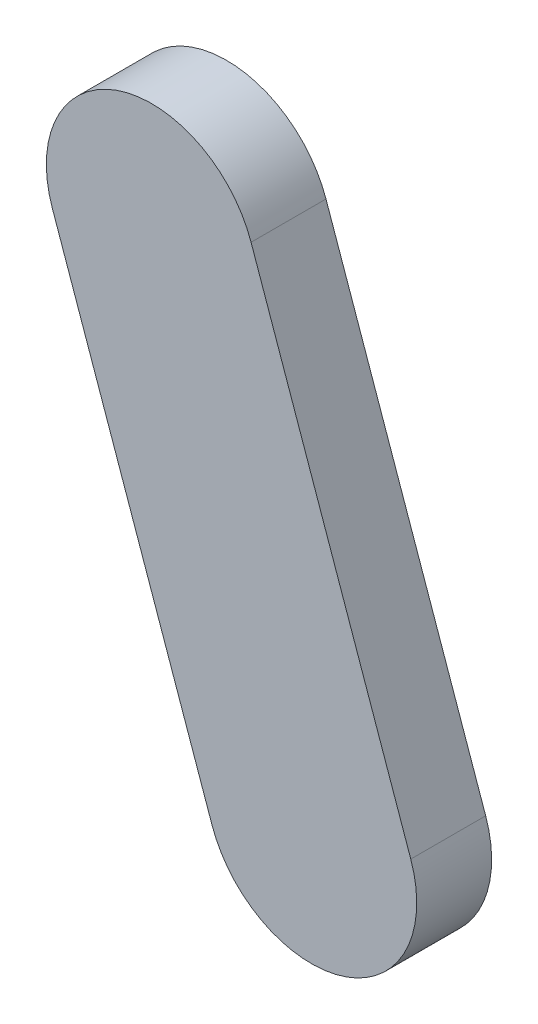
ISO-10303-21;
HEADER;
FILE_DESCRIPTION(('STEP AP214'),'2;1');
FILE_NAME('part.step','',(''),(''),'','','');
FILE_SCHEMA(('AUTOMOTIVE_DESIGN { 1 0 10303 214 1 1 1 1 }'));
ENDSEC;
DATA;
#1=APPLICATION_CONTEXT('core data for automotive mechanical design processes');
#2=APPLICATION_PROTOCOL_DEFINITION('international standard','automotive_design',2000,#1);
#3=PRODUCT_CONTEXT('',#1,'mechanical');
#4=PRODUCT('Part','Part','',(#3));
#5=PRODUCT_RELATED_PRODUCT_CATEGORY('part','',(#4));
#6=PRODUCT_DEFINITION_FORMATION('','',#4);
#7=PRODUCT_DEFINITION_CONTEXT('part definition',#1,'design');
#8=PRODUCT_DEFINITION('design','',#6,#7);
#9=PRODUCT_DEFINITION_SHAPE('','',#8);
#10=(LENGTH_UNIT() NAMED_UNIT(*) SI_UNIT(.MILLI.,.METRE.));
#11=(NAMED_UNIT(*) PLANE_ANGLE_UNIT() SI_UNIT($,.RADIAN.));
#12=(NAMED_UNIT(*) SI_UNIT($,.STERADIAN.) SOLID_ANGLE_UNIT());
#13=UNCERTAINTY_MEASURE_WITH_UNIT(LENGTH_MEASURE(1.E-05),#10,'distance_accuracy_value','');
#14=(GEOMETRIC_REPRESENTATION_CONTEXT(3) GLOBAL_UNCERTAINTY_ASSIGNED_CONTEXT((#13)) GLOBAL_UNIT_ASSIGNED_CONTEXT((#10,
#11,#12)) REPRESENTATION_CONTEXT('',''));
#15=CARTESIAN_POINT('',(0.,0.,0.));
#16=DIRECTION('',(0.,0.,1.));
#17=DIRECTION('',(1.,0.,0.));
#18=AXIS2_PLACEMENT_3D('',#15,#16,#17);
#19=CARTESIAN_POINT('',(-266.501997607716,107.832873361256,22.86));
#20=DIRECTION('',(0.,0.,-1.));
#21=DIRECTION('',(-1.,0.,0.));
#22=AXIS2_PLACEMENT_3D('',#19,#20,#21);
#23=CYLINDRICAL_SURFACE('',#22,25.);
#24=CARTESIAN_POINT('',(-266.501997607716,107.832873361256,5.08));
#25=DIRECTION('',(0.,0.,1.));
#26=DIRECTION('',(-1.,0.,0.));
#27=AXIS2_PLACEMENT_3D('',#24,#25,#26);
#28=CIRCLE('',#27,25.);
#29=CARTESIAN_POINT('',(-242.916504746549,116.122899084728,5.08));
#30=VERTEX_POINT('',#29);
#31=CARTESIAN_POINT('',(-290.087490468883,99.5428476377833,5.08));
#32=VERTEX_POINT('',#31);
#33=EDGE_CURVE('E97',#30,#32,#28,.T.);
#34=ORIENTED_EDGE('',*,*,#33,.T.);
#35=DIRECTION('',(0.,0.,-1.));
#36=VECTOR('',#35,1.);
#37=CARTESIAN_POINT('',(-290.087490468883,99.5428476377833,22.86));
#38=LINE('',#37,#36);
#39=CARTESIAN_POINT('',(-290.087490468883,99.5428476377833,22.86));
#40=VERTEX_POINT('',#39);
#41=EDGE_CURVE('E11',#40,#32,#38,.T.);
#42=ORIENTED_EDGE('',*,*,#41,.F.);
#43=CARTESIAN_POINT('',(-266.501997607716,107.832873361256,22.86));
#44=DIRECTION('',(0.,0.,1.));
#45=DIRECTION('',(-1.,0.,0.));
#46=AXIS2_PLACEMENT_3D('',#43,#44,#45);
#47=CIRCLE('',#46,25.);
#48=CARTESIAN_POINT('',(-242.916504746549,116.122899084728,22.86));
#49=VERTEX_POINT('',#48);
#50=EDGE_CURVE('E85',#49,#40,#47,.T.);
#51=ORIENTED_EDGE('',*,*,#50,.F.);
#52=DIRECTION('',(0.,0.,-1.));
#53=VECTOR('',#52,1.);
#54=CARTESIAN_POINT('',(-242.916504746549,116.122899084728,22.86));
#55=LINE('',#54,#53);
#56=EDGE_CURVE('E93',#49,#30,#55,.T.);
#57=ORIENTED_EDGE('',*,*,#56,.T.);
#58=EDGE_LOOP('',(#34,#42,#51,#57));
#59=FACE_BOUND('',#58,.T.);
#60=ADVANCED_FACE('F34',(#59),#23,.T.);
#61=CARTESIAN_POINT('',(-290.087490468883,99.5428476377833,22.86));
#62=DIRECTION('',(0.943419714446684,0.331601028938901,0.));
#63=DIRECTION('',(-0.331601028938901,0.943419714446684,0.));
#64=AXIS2_PLACEMENT_3D('',#61,#62,#63);
#65=PLANE('',#64);
#66=DIRECTION('',(0.331601028938901,-0.943419714446684,0.));
#67=VECTOR('',#66,1.);
#68=CARTESIAN_POINT('',(-290.087490468883,99.5428476377833,5.08));
#69=LINE('',#68,#67);
#70=CARTESIAN_POINT('',(-252.185492861167,-8.2900257234726,5.08));
#71=VERTEX_POINT('',#70);
#72=EDGE_CURVE('E89',#32,#71,#69,.T.);
#73=ORIENTED_EDGE('',*,*,#72,.T.);
#74=DIRECTION('',(0.,0.,-1.));
#75=VECTOR('',#74,1.);
#76=CARTESIAN_POINT('',(-252.185492861167,-8.2900257234726,22.86));
#77=LINE('',#76,#75);
#78=CARTESIAN_POINT('',(-252.185492861167,-8.2900257234726,22.86));
#79=VERTEX_POINT('',#78);
#80=EDGE_CURVE('E42',#79,#71,#77,.T.);
#81=ORIENTED_EDGE('',*,*,#80,.F.);
#82=DIRECTION('',(0.331601028938901,-0.943419714446684,0.));
#83=VECTOR('',#82,1.);
#84=CARTESIAN_POINT('',(-290.087490468883,99.5428476377833,22.86));
#85=LINE('',#84,#83);
#86=EDGE_CURVE('E80',#40,#79,#85,.T.);
#87=ORIENTED_EDGE('',*,*,#86,.F.);
#88=ORIENTED_EDGE('',*,*,#41,.T.);
#89=EDGE_LOOP('',(#73,#81,#87,#88));
#90=FACE_BOUND('',#89,.T.);
#91=ADVANCED_FACE('F88',(#90),#65,.F.);
#92=CARTESIAN_POINT('',(-228.6,0.,22.86));
#93=DIRECTION('',(0.,0.,-1.));
#94=DIRECTION('',(-1.,0.,0.));
#95=AXIS2_PLACEMENT_3D('',#92,#93,#94);
#96=CYLINDRICAL_SURFACE('',#95,25.);
#97=CARTESIAN_POINT('',(-228.6,0.,5.08));
#98=DIRECTION('',(0.,0.,1.));
#99=DIRECTION('',(-1.,0.,0.));
#100=AXIS2_PLACEMENT_3D('',#97,#98,#99);
#101=CIRCLE('',#100,25.);
#102=CARTESIAN_POINT('',(-205.014507138833,8.29002572347244,5.08));
#103=VERTEX_POINT('',#102);
#104=EDGE_CURVE('E67',#71,#103,#101,.T.);
#105=ORIENTED_EDGE('',*,*,#104,.T.);
#106=DIRECTION('',(0.,0.,-1.));
#107=VECTOR('',#106,1.);
#108=CARTESIAN_POINT('',(-205.014507138833,8.29002572347244,22.86));
#109=LINE('',#108,#107);
#110=CARTESIAN_POINT('',(-205.014507138833,8.29002572347244,22.86));
#111=VERTEX_POINT('',#110);
#112=EDGE_CURVE('E90',#111,#103,#109,.T.);
#113=ORIENTED_EDGE('',*,*,#112,.F.);
#114=CARTESIAN_POINT('',(-228.6,0.,22.86));
#115=DIRECTION('',(0.,0.,1.));
#116=DIRECTION('',(-1.,0.,0.));
#117=AXIS2_PLACEMENT_3D('',#114,#115,#116);
#118=CIRCLE('',#117,25.);
#119=EDGE_CURVE('E83',#79,#111,#118,.T.);
#120=ORIENTED_EDGE('',*,*,#119,.F.);
#121=ORIENTED_EDGE('',*,*,#80,.T.);
#122=EDGE_LOOP('',(#105,#113,#120,#121));
#123=FACE_BOUND('',#122,.T.);
#124=ADVANCED_FACE('F91',(#123),#96,.T.);
#125=CARTESIAN_POINT('',(-242.916504746549,116.122899084728,22.86));
#126=DIRECTION('',(-0.943419714446684,-0.331601028938901,0.));
#127=DIRECTION('',(0.331601028938901,-0.943419714446684,0.));
#128=AXIS2_PLACEMENT_3D('',#125,#126,#127);
#129=PLANE('',#128);
#130=DIRECTION('',(-0.331601028938901,0.943419714446684,0.));
#131=VECTOR('',#130,1.);
#132=CARTESIAN_POINT('',(-242.916504746549,116.122899084728,5.08));
#133=LINE('',#132,#131);
#134=EDGE_CURVE('E73',#103,#30,#133,.T.);
#135=ORIENTED_EDGE('',*,*,#134,.T.);
#136=ORIENTED_EDGE('',*,*,#56,.F.);
#137=DIRECTION('',(-0.331601028938901,0.943419714446684,0.));
#138=VECTOR('',#137,1.);
#139=CARTESIAN_POINT('',(-242.916504746549,116.122899084728,22.86));
#140=LINE('',#139,#138);
#141=EDGE_CURVE('E50',#111,#49,#140,.T.);
#142=ORIENTED_EDGE('',*,*,#141,.F.);
#143=ORIENTED_EDGE('',*,*,#112,.T.);
#144=EDGE_LOOP('',(#135,#136,#142,#143));
#145=FACE_BOUND('',#144,.T.);
#146=ADVANCED_FACE('F104',(#145),#129,.F.);
#147=CARTESIAN_POINT('',(-266.501997607716,107.832873361256,22.86));
#148=DIRECTION('',(0.,0.,-1.));
#149=DIRECTION('',(-1.,0.,0.));
#150=AXIS2_PLACEMENT_3D('',#147,#148,#149);
#151=PLANE('',#150);
#152=ORIENTED_EDGE('',*,*,#50,.T.);
#153=ORIENTED_EDGE('',*,*,#86,.T.);
#154=ORIENTED_EDGE('',*,*,#119,.T.);
#155=ORIENTED_EDGE('',*,*,#141,.T.);
#156=EDGE_LOOP('',(#152,#153,#154,#155));
#157=FACE_BOUND('',#156,.T.);
#158=ADVANCED_FACE('F81',(#157),#151,.F.);
#159=CARTESIAN_POINT('',(-266.501997607716,107.832873361256,5.08));
#160=DIRECTION('',(0.,0.,-1.));
#161=DIRECTION('',(-1.,0.,0.));
#162=AXIS2_PLACEMENT_3D('',#159,#160,#161);
#163=PLANE('',#162);
#164=ORIENTED_EDGE('',*,*,#33,.F.);
#165=ORIENTED_EDGE('',*,*,#134,.F.);
#166=ORIENTED_EDGE('',*,*,#104,.F.);
#167=ORIENTED_EDGE('',*,*,#72,.F.);
#168=EDGE_LOOP('',(#164,#165,#166,#167));
#169=FACE_BOUND('',#168,.T.);
#170=ADVANCED_FACE('F107',(#169),#163,.T.);
#171=CLOSED_SHELL('',(#60,#91,#124,#146,#158,#170));
#172=MANIFOLD_SOLID_BREP('B2',#171);
#173=ADVANCED_BREP_SHAPE_REPRESENTATION('',(#18,#172),#14);
#174=SHAPE_DEFINITION_REPRESENTATION(#9,#173);
ENDSEC;
END-ISO-10303-21;
